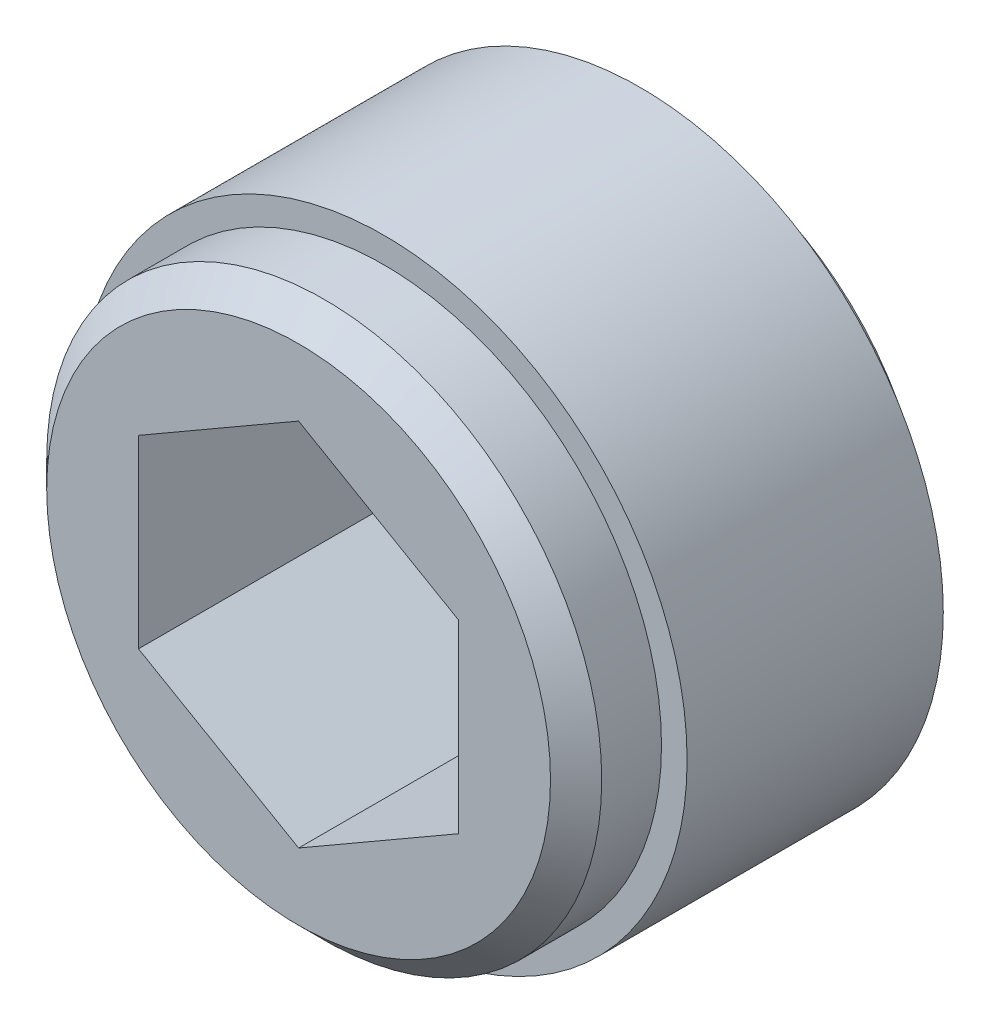
ISO-10303-21;
HEADER;
FILE_DESCRIPTION(('STEP AP214'),'2;1');
FILE_NAME('part.step','',(''),(''),'','','');
FILE_SCHEMA(('AUTOMOTIVE_DESIGN { 1 0 10303 214 1 1 1 1 }'));
ENDSEC;
DATA;
#1=APPLICATION_CONTEXT('core data for automotive mechanical design processes');
#2=APPLICATION_PROTOCOL_DEFINITION('international standard','automotive_design',2000,#1);
#3=PRODUCT_CONTEXT('',#1,'mechanical');
#4=PRODUCT('Part','Part','',(#3));
#5=PRODUCT_RELATED_PRODUCT_CATEGORY('part','',(#4));
#6=PRODUCT_DEFINITION_FORMATION('','',#4);
#7=PRODUCT_DEFINITION_CONTEXT('part definition',#1,'design');
#8=PRODUCT_DEFINITION('design','',#6,#7);
#9=PRODUCT_DEFINITION_SHAPE('','',#8);
#10=(LENGTH_UNIT() NAMED_UNIT(*) SI_UNIT(.MILLI.,.METRE.));
#11=(NAMED_UNIT(*) PLANE_ANGLE_UNIT() SI_UNIT($,.RADIAN.));
#12=(NAMED_UNIT(*) SI_UNIT($,.STERADIAN.) SOLID_ANGLE_UNIT());
#13=UNCERTAINTY_MEASURE_WITH_UNIT(LENGTH_MEASURE(1.E-05),#10,'distance_accuracy_value','');
#14=(GEOMETRIC_REPRESENTATION_CONTEXT(3) GLOBAL_UNCERTAINTY_ASSIGNED_CONTEXT((#13)) GLOBAL_UNIT_ASSIGNED_CONTEXT((#10,
#11,#12)) REPRESENTATION_CONTEXT('',''));
#15=CARTESIAN_POINT('',(0.,0.,0.));
#16=DIRECTION('',(0.,0.,1.));
#17=DIRECTION('',(1.,0.,0.));
#18=AXIS2_PLACEMENT_3D('',#15,#16,#17);
#19=CARTESIAN_POINT('',(0.,0.,5.08));
#20=DIRECTION('',(0.,0.,-1.));
#21=DIRECTION('',(-1.,0.,0.));
#22=AXIS2_PLACEMENT_3D('',#19,#20,#21);
#23=CYLINDRICAL_SURFACE('',#22,4.5085);
#24=CARTESIAN_POINT('',(0.,0.,0.));
#25=DIRECTION('',(0.,0.,1.));
#26=DIRECTION('',(1.,0.,0.));
#27=AXIS2_PLACEMENT_3D('',#24,#25,#26);
#28=CIRCLE('',#27,4.5085);
#29=CARTESIAN_POINT('',(4.5085,0.,0.));
#30=VERTEX_POINT('',#29);
#31=EDGE_CURVE('E164',#30,#30,#28,.T.);
#32=ORIENTED_EDGE('',*,*,#31,.T.);
#33=EDGE_LOOP('',(#32));
#34=FACE_BOUND('',#33,.T.);
#35=CARTESIAN_POINT('',(0.,0.,3.81));
#36=DIRECTION('',(0.,0.,1.));
#37=DIRECTION('',(1.,0.,0.));
#38=AXIS2_PLACEMENT_3D('',#35,#36,#37);
#39=CIRCLE('',#38,4.5085);
#40=CARTESIAN_POINT('',(4.5085,0.,3.81));
#41=VERTEX_POINT('',#40);
#42=EDGE_CURVE('E157',#41,#41,#39,.T.);
#43=ORIENTED_EDGE('',*,*,#42,.F.);
#44=EDGE_LOOP('',(#43));
#45=FACE_BOUND('',#44,.T.);
#46=ADVANCED_FACE('F48',(#34,#45),#23,.T.);
#47=CARTESIAN_POINT('',(0.,0.,0.));
#48=DIRECTION('',(0.,0.,1.));
#49=DIRECTION('',(1.,0.,0.));
#50=AXIS2_PLACEMENT_3D('',#47,#48,#49);
#51=PLANE('',#50);
#52=CARTESIAN_POINT('',(0.,0.,0.));
#53=DIRECTION('',(0.,0.,-1.));
#54=DIRECTION('',(-1.,0.,0.));
#55=AXIS2_PLACEMENT_3D('',#52,#53,#54);
#56=CIRCLE('',#55,3.81);
#57=CARTESIAN_POINT('',(-3.81,0.,0.));
#58=VERTEX_POINT('',#57);
#59=EDGE_CURVE('E161',#58,#58,#56,.T.);
#60=ORIENTED_EDGE('',*,*,#59,.F.);
#61=EDGE_LOOP('',(#60));
#62=FACE_BOUND('',#61,.T.);
#63=ORIENTED_EDGE('',*,*,#31,.F.);
#64=EDGE_LOOP('',(#63));
#65=FACE_BOUND('',#64,.T.);
#66=ADVANCED_FACE('F188',(#62,#65),#51,.F.);
#67=CARTESIAN_POINT('',(0.,0.,0.));
#68=DIRECTION('',(0.,0.,1.));
#69=DIRECTION('',(-1.,0.,0.));
#70=AXIS2_PLACEMENT_3D('',#67,#68,#69);
#71=CONICAL_SURFACE('',#70,3.81,0.26179938779915);
#72=CARTESIAN_POINT('',(0.,0.,-0.635));
#73=DIRECTION('',(0.,0.,-1.));
#74=DIRECTION('',(-1.,0.,0.));
#75=AXIS2_PLACEMENT_3D('',#72,#73,#74);
#76=CIRCLE('',#75,3.63985226280624);
#77=CARTESIAN_POINT('',(-3.63985226280624,0.,-0.635));
#78=VERTEX_POINT('',#77);
#79=EDGE_CURVE('E160',#78,#78,#76,.T.);
#80=ORIENTED_EDGE('',*,*,#79,.F.);
#81=EDGE_LOOP('',(#80));
#82=FACE_BOUND('',#81,.T.);
#83=ORIENTED_EDGE('',*,*,#59,.T.);
#84=EDGE_LOOP('',(#83));
#85=FACE_BOUND('',#84,.T.);
#86=ADVANCED_FACE('F193',(#82,#85),#71,.T.);
#87=CARTESIAN_POINT('',(0.,0.,-0.635));
#88=DIRECTION('',(0.,0.,-1.));
#89=DIRECTION('',(-1.,0.,0.));
#90=AXIS2_PLACEMENT_3D('',#87,#88,#89);
#91=PLANE('',#90);
#92=DIRECTION('',(0.866025403784439,-0.5,0.));
#93=VECTOR('',#92,1.);
#94=CARTESIAN_POINT('',(-2.38125,-1.3748153285078,-0.635));
#95=LINE('',#94,#93);
#96=CARTESIAN_POINT('',(-2.38125,-1.3748153285078,-0.635));
#97=VERTEX_POINT('',#96);
#98=CARTESIAN_POINT('',(0.,-2.74963065701559,-0.635));
#99=VERTEX_POINT('',#98);
#100=EDGE_CURVE('E104',#97,#99,#95,.T.);
#101=ORIENTED_EDGE('',*,*,#100,.T.);
#102=DIRECTION('',(0.866025403784438,0.5,0.));
#103=VECTOR('',#102,1.);
#104=CARTESIAN_POINT('',(0.,-2.74963065701559,-0.635));
#105=LINE('',#104,#103);
#106=CARTESIAN_POINT('',(2.38125,-1.3748153285078,-0.635));
#107=VERTEX_POINT('',#106);
#108=EDGE_CURVE('E113',#99,#107,#105,.T.);
#109=ORIENTED_EDGE('',*,*,#108,.T.);
#110=DIRECTION('',(0.,1.,0.));
#111=VECTOR('',#110,1.);
#112=CARTESIAN_POINT('',(2.38125,-1.3748153285078,-0.635));
#113=LINE('',#112,#111);
#114=CARTESIAN_POINT('',(2.38125,1.3748153285078,-0.635));
#115=VERTEX_POINT('',#114);
#116=EDGE_CURVE('E64',#107,#115,#113,.T.);
#117=ORIENTED_EDGE('',*,*,#116,.T.);
#118=DIRECTION('',(-0.866025403784439,0.5,0.));
#119=VECTOR('',#118,1.);
#120=CARTESIAN_POINT('',(2.38125,1.3748153285078,-0.635));
#121=LINE('',#120,#119);
#122=CARTESIAN_POINT('',(0.,2.74963065701559,-0.635));
#123=VERTEX_POINT('',#122);
#124=EDGE_CURVE('E128',#115,#123,#121,.T.);
#125=ORIENTED_EDGE('',*,*,#124,.T.);
#126=DIRECTION('',(-0.866025403784439,-0.5,0.));
#127=VECTOR('',#126,1.);
#128=CARTESIAN_POINT('',(0.,2.74963065701559,-0.635));
#129=LINE('',#128,#127);
#130=CARTESIAN_POINT('',(-2.38125,1.3748153285078,-0.635));
#131=VERTEX_POINT('',#130);
#132=EDGE_CURVE('E131',#123,#131,#129,.T.);
#133=ORIENTED_EDGE('',*,*,#132,.T.);
#134=DIRECTION('',(0.,-1.,0.));
#135=VECTOR('',#134,1.);
#136=CARTESIAN_POINT('',(-2.38125,1.3748153285078,-0.635));
#137=LINE('',#136,#135);
#138=EDGE_CURVE('E110',#131,#97,#137,.T.);
#139=ORIENTED_EDGE('',*,*,#138,.T.);
#140=EDGE_LOOP('',(#101,#109,#117,#125,#133,#139));
#141=FACE_BOUND('',#140,.T.);
#142=ORIENTED_EDGE('',*,*,#79,.T.);
#143=EDGE_LOOP('',(#142));
#144=FACE_BOUND('',#143,.T.);
#145=ADVANCED_FACE('F117',(#141,#144),#91,.T.);
#146=CARTESIAN_POINT('',(0.,0.,3.81));
#147=DIRECTION('',(0.,0.,1.));
#148=DIRECTION('',(1.,0.,0.));
#149=AXIS2_PLACEMENT_3D('',#146,#147,#148);
#150=CYLINDRICAL_SURFACE('',#149,4.1275);
#151=CARTESIAN_POINT('',(0.,0.,4.699));
#152=DIRECTION('',(0.,0.,1.));
#153=DIRECTION('',(1.,0.,0.));
#154=AXIS2_PLACEMENT_3D('',#151,#152,#153);
#155=CIRCLE('',#154,4.1275);
#156=CARTESIAN_POINT('',(-4.1275,0.,4.699));
#157=VERTEX_POINT('',#156);
#158=EDGE_CURVE('E11',#157,#157,#155,.F.);
#159=ORIENTED_EDGE('',*,*,#158,.T.);
#160=EDGE_LOOP('',(#159));
#161=FACE_BOUND('',#160,.T.);
#162=CARTESIAN_POINT('',(0.,0.,3.81));
#163=DIRECTION('',(0.,0.,1.));
#164=DIRECTION('',(1.,0.,0.));
#165=AXIS2_PLACEMENT_3D('',#162,#163,#164);
#166=CIRCLE('',#165,4.1275);
#167=CARTESIAN_POINT('',(4.1275,0.,3.81));
#168=VERTEX_POINT('',#167);
#169=EDGE_CURVE('E147',#168,#168,#166,.T.);
#170=ORIENTED_EDGE('',*,*,#169,.T.);
#171=EDGE_LOOP('',(#170));
#172=FACE_BOUND('',#171,.T.);
#173=ADVANCED_FACE('F202',(#161,#172),#150,.T.);
#174=CARTESIAN_POINT('',(0.,0.,3.81));
#175=DIRECTION('',(0.,0.,1.));
#176=DIRECTION('',(1.,0.,0.));
#177=AXIS2_PLACEMENT_3D('',#174,#175,#176);
#178=PLANE('',#177);
#179=ORIENTED_EDGE('',*,*,#169,.F.);
#180=EDGE_LOOP('',(#179));
#181=FACE_BOUND('',#180,.T.);
#182=ORIENTED_EDGE('',*,*,#42,.T.);
#183=EDGE_LOOP('',(#182));
#184=FACE_BOUND('',#183,.T.);
#185=ADVANCED_FACE('F183',(#181,#184),#178,.T.);
#186=CARTESIAN_POINT('',(0.,0.,5.08));
#187=DIRECTION('',(0.,0.,1.));
#188=DIRECTION('',(1.,0.,0.));
#189=AXIS2_PLACEMENT_3D('',#186,#187,#188);
#190=PLANE('',#189);
#191=DIRECTION('',(0.866025403784439,-0.5,0.));
#192=VECTOR('',#191,1.);
#193=CARTESIAN_POINT('',(-2.38125,-1.3748153285078,5.08));
#194=LINE('',#193,#192);
#195=CARTESIAN_POINT('',(-2.38125,-1.3748153285078,5.08));
#196=VERTEX_POINT('',#195);
#197=CARTESIAN_POINT('',(0.,-2.74963065701559,5.08));
#198=VERTEX_POINT('',#197);
#199=EDGE_CURVE('E72',#196,#198,#194,.T.);
#200=ORIENTED_EDGE('',*,*,#199,.F.);
#201=DIRECTION('',(0.,-1.,0.));
#202=VECTOR('',#201,1.);
#203=CARTESIAN_POINT('',(-2.38125,1.3748153285078,5.08));
#204=LINE('',#203,#202);
#205=CARTESIAN_POINT('',(-2.38125,1.3748153285078,5.08));
#206=VERTEX_POINT('',#205);
#207=EDGE_CURVE('E121',#206,#196,#204,.T.);
#208=ORIENTED_EDGE('',*,*,#207,.F.);
#209=DIRECTION('',(-0.866025403784439,-0.5,0.));
#210=VECTOR('',#209,1.);
#211=CARTESIAN_POINT('',(0.,2.74963065701559,5.08));
#212=LINE('',#211,#210);
#213=CARTESIAN_POINT('',(0.,2.74963065701559,5.08));
#214=VERTEX_POINT('',#213);
#215=EDGE_CURVE('E124',#214,#206,#212,.T.);
#216=ORIENTED_EDGE('',*,*,#215,.F.);
#217=DIRECTION('',(-0.866025403784439,0.5,0.));
#218=VECTOR('',#217,1.);
#219=CARTESIAN_POINT('',(2.38125,1.3748153285078,5.08));
#220=LINE('',#219,#218);
#221=CARTESIAN_POINT('',(2.38125,1.3748153285078,5.08));
#222=VERTEX_POINT('',#221);
#223=EDGE_CURVE('E140',#222,#214,#220,.T.);
#224=ORIENTED_EDGE('',*,*,#223,.F.);
#225=DIRECTION('',(0.,1.,0.));
#226=VECTOR('',#225,1.);
#227=CARTESIAN_POINT('',(2.38125,-1.3748153285078,5.08));
#228=LINE('',#227,#226);
#229=CARTESIAN_POINT('',(2.38125,-1.3748153285078,5.08));
#230=VERTEX_POINT('',#229);
#231=EDGE_CURVE('E137',#230,#222,#228,.T.);
#232=ORIENTED_EDGE('',*,*,#231,.F.);
#233=DIRECTION('',(0.866025403784438,0.5,0.));
#234=VECTOR('',#233,1.);
#235=CARTESIAN_POINT('',(0.,-2.74963065701559,5.08));
#236=LINE('',#235,#234);
#237=EDGE_CURVE('E135',#198,#230,#236,.T.);
#238=ORIENTED_EDGE('',*,*,#237,.F.);
#239=EDGE_LOOP('',(#200,#208,#216,#224,#232,#238));
#240=FACE_BOUND('',#239,.T.);
#241=CARTESIAN_POINT('',(0.,0.,5.08));
#242=DIRECTION('',(0.,0.,1.));
#243=DIRECTION('',(1.,0.,0.));
#244=AXIS2_PLACEMENT_3D('',#241,#242,#243);
#245=CIRCLE('',#244,3.7465);
#246=CARTESIAN_POINT('',(-3.7465,0.,5.08));
#247=VERTEX_POINT('',#246);
#248=EDGE_CURVE('E57',#247,#247,#245,.T.);
#249=ORIENTED_EDGE('',*,*,#248,.T.);
#250=EDGE_LOOP('',(#249));
#251=FACE_BOUND('',#250,.T.);
#252=ADVANCED_FACE('F171',(#240,#251),#190,.T.);
#253=CARTESIAN_POINT('',(0.,0.,5.08));
#254=DIRECTION('',(0.,0.,-1.));
#255=DIRECTION('',(-1.,0.,0.));
#256=AXIS2_PLACEMENT_3D('',#253,#254,#255);
#257=CONICAL_SURFACE('',#256,3.7465,0.785398163397446);
#258=CARTESIAN_POINT('',(-4.1275,0.,4.699));
#259=CARTESIAN_POINT('',(-4.12353125,0.,4.70296875));
#260=CARTESIAN_POINT('',(-4.1195625,0.,4.7069375));
#261=CARTESIAN_POINT('',(-4.111625,0.,4.714875));
#262=CARTESIAN_POINT('',(-4.10765625,0.,4.71884375));
#263=CARTESIAN_POINT('',(-4.09971875,0.,4.72678125));
#264=CARTESIAN_POINT('',(-4.09575,0.,4.73075));
#265=CARTESIAN_POINT('',(-4.0878125,0.,4.7386875));
#266=CARTESIAN_POINT('',(-4.08384375,0.,4.74265625));
#267=CARTESIAN_POINT('',(-4.07590625,0.,4.75059375));
#268=CARTESIAN_POINT('',(-4.0719375,0.,4.7545625));
#269=CARTESIAN_POINT('',(-4.064,0.,4.7625));
#270=CARTESIAN_POINT('',(-4.06003125,0.,4.76646875));
#271=CARTESIAN_POINT('',(-4.05209375,0.,4.77440625));
#272=CARTESIAN_POINT('',(-4.048125,0.,4.778375));
#273=CARTESIAN_POINT('',(-4.0401875,0.,4.7863125));
#274=CARTESIAN_POINT('',(-4.03621875,0.,4.79028125));
#275=CARTESIAN_POINT('',(-4.02828125,0.,4.79821875));
#276=CARTESIAN_POINT('',(-4.0243125,0.,4.8021875));
#277=CARTESIAN_POINT('',(-4.016375,0.,4.810125));
#278=CARTESIAN_POINT('',(-4.01240625,0.,4.81409375));
#279=CARTESIAN_POINT('',(-4.00446875,0.,4.82203125));
#280=CARTESIAN_POINT('',(-4.0005,0.,4.826));
#281=CARTESIAN_POINT('',(-3.9925625,0.,4.8339375));
#282=CARTESIAN_POINT('',(-3.98859375,0.,4.83790625));
#283=CARTESIAN_POINT('',(-3.98065625,0.,4.84584375));
#284=CARTESIAN_POINT('',(-3.9766875,0.,4.8498125));
#285=CARTESIAN_POINT('',(-3.96875,0.,4.85775));
#286=CARTESIAN_POINT('',(-3.96478125,0.,4.86171875));
#287=CARTESIAN_POINT('',(-3.95684375,0.,4.86965625));
#288=CARTESIAN_POINT('',(-3.952875,0.,4.873625));
#289=CARTESIAN_POINT('',(-3.9449375,0.,4.8815625));
#290=CARTESIAN_POINT('',(-3.94096875,0.,4.88553125));
#291=CARTESIAN_POINT('',(-3.93303125,0.,4.89346875));
#292=CARTESIAN_POINT('',(-3.9290625,0.,4.8974375));
#293=CARTESIAN_POINT('',(-3.921125,0.,4.905375));
#294=CARTESIAN_POINT('',(-3.91715625,0.,4.90934375));
#295=CARTESIAN_POINT('',(-3.90921875,0.,4.91728125));
#296=CARTESIAN_POINT('',(-3.90525,0.,4.92125));
#297=CARTESIAN_POINT('',(-3.8973125,0.,4.9291875));
#298=CARTESIAN_POINT('',(-3.89334375,0.,4.93315625));
#299=CARTESIAN_POINT('',(-3.88540625,0.,4.94109375));
#300=CARTESIAN_POINT('',(-3.8814375,0.,4.9450625));
#301=CARTESIAN_POINT('',(-3.8735,0.,4.953));
#302=CARTESIAN_POINT('',(-3.86953125,0.,4.95696875));
#303=CARTESIAN_POINT('',(-3.86159375,0.,4.96490625));
#304=CARTESIAN_POINT('',(-3.857625,0.,4.968875));
#305=CARTESIAN_POINT('',(-3.8496875,0.,4.9768125));
#306=CARTESIAN_POINT('',(-3.84571875,0.,4.98078125));
#307=CARTESIAN_POINT('',(-3.83778125,0.,4.98871875));
#308=CARTESIAN_POINT('',(-3.8338125,0.,4.9926875));
#309=CARTESIAN_POINT('',(-3.825875,0.,5.000625));
#310=CARTESIAN_POINT('',(-3.82190625,0.,5.00459375));
#311=CARTESIAN_POINT('',(-3.81396875,0.,5.01253125));
#312=CARTESIAN_POINT('',(-3.81,0.,5.0165));
#313=CARTESIAN_POINT('',(-3.8020625,0.,5.0244375));
#314=CARTESIAN_POINT('',(-3.79809375,0.,5.02840625));
#315=CARTESIAN_POINT('',(-3.79015625,0.,5.03634375));
#316=CARTESIAN_POINT('',(-3.7861875,0.,5.0403125));
#317=CARTESIAN_POINT('',(-3.77825,0.,5.04825));
#318=CARTESIAN_POINT('',(-3.77428125,0.,5.05221875));
#319=CARTESIAN_POINT('',(-3.76634375,0.,5.06015625));
#320=CARTESIAN_POINT('',(-3.762375,0.,5.064125));
#321=CARTESIAN_POINT('',(-3.7544375,0.,5.0720625));
#322=CARTESIAN_POINT('',(-3.75046875,0.,5.07603125));
#323=CARTESIAN_POINT('',(-3.7465,0.,5.08));
#324=B_SPLINE_CURVE_WITH_KNOTS('',3,(#258,#259,#260,#261,#262,#263,#264,#265,#266,#267,#268,
#269,#270,#271,#272,#273,#274,#275,#276,#277,#278,#279,#280,#281,#282,#283,#284,#285,#286,#287,
#288,#289,#290,#291,#292,#293,#294,#295,#296,#297,#298,#299,#300,#301,#302,#303,#304,#305,#306,
#307,#308,#309,#310,#311,#312,#313,#314,#315,#316,#317,#318,#319,#320,#321,#322,#323),
.UNSPECIFIED.,.F.,.F.,(4,2,2,2,2,2,2,2,2,2,2,2,2,2,2,2,2,2,2,2,2,2,2,2,2,2,2,2,2,2,2,2,4),(0.,
0.0168379802270056,0.0336759604540099,0.0505139406810142,0.0673519209080192,0.0841899011350235,
0.101027881362028,0.117865861589033,0.134703841816038,0.151541822043042,0.168379802270047,
0.185217782497052,0.202055762724056,0.218893742951061,0.235731723178065,0.25256970340507,
0.269407683632075,0.286245663859079,0.303083644086084,0.319921624313089,0.336759604540093,
0.353597584767098,0.370435564994103,0.387273545221107,0.404111525448112,0.420949505675117,
0.437787485902121,0.454625466129126,0.47146344635613,0.488301426583135,0.50513940681014,
0.521977387037144,0.538815367264149),.UNSPECIFIED.);
#325=EDGE_CURVE('BSEAM51',#157,#247,#324,.T.);
#326=ORIENTED_EDGE('',*,*,#158,.F.);
#327=ORIENTED_EDGE('',*,*,#248,.F.);
#328=ORIENTED_EDGE('',*,*,#325,.T.);
#329=ORIENTED_EDGE('',*,*,#325,.F.);
#330=EDGE_LOOP('',(#326,#328,#327,#329));
#331=FACE_BOUND('',#330,.T.);
#332=ADVANCED_FACE('F51',(#331),#257,.T.);
#333=CARTESIAN_POINT('',(-2.38125,-1.3748153285078,-0.635));
#334=DIRECTION('',(-0.5,-0.866025403784439,0.));
#335=DIRECTION('',(0.866025403784439,-0.5,0.));
#336=AXIS2_PLACEMENT_3D('',#333,#334,#335);
#337=PLANE('',#336);
#338=ORIENTED_EDGE('',*,*,#199,.T.);
#339=DIRECTION('',(0.,0.,1.));
#340=VECTOR('',#339,1.);
#341=CARTESIAN_POINT('',(0.,-2.74963065701559,-0.635));
#342=LINE('',#341,#340);
#343=EDGE_CURVE('E100',#99,#198,#342,.T.);
#344=ORIENTED_EDGE('',*,*,#343,.F.);
#345=ORIENTED_EDGE('',*,*,#100,.F.);
#346=DIRECTION('',(0.,0.,1.));
#347=VECTOR('',#346,1.);
#348=CARTESIAN_POINT('',(-2.38125,-1.3748153285078,-0.635));
#349=LINE('',#348,#347);
#350=EDGE_CURVE('E145',#97,#196,#349,.T.);
#351=ORIENTED_EDGE('',*,*,#350,.T.);
#352=EDGE_LOOP('',(#338,#344,#345,#351));
#353=FACE_BOUND('',#352,.T.);
#354=ADVANCED_FACE('F102',(#353),#337,.F.);
#355=CARTESIAN_POINT('',(-2.38125,1.3748153285078,-0.635));
#356=DIRECTION('',(-1.,0.,0.));
#357=DIRECTION('',(0.,0.,1.));
#358=AXIS2_PLACEMENT_3D('',#355,#356,#357);
#359=PLANE('',#358);
#360=ORIENTED_EDGE('',*,*,#207,.T.);
#361=ORIENTED_EDGE('',*,*,#350,.F.);
#362=ORIENTED_EDGE('',*,*,#138,.F.);
#363=DIRECTION('',(0.,0.,1.));
#364=VECTOR('',#363,1.);
#365=CARTESIAN_POINT('',(-2.38125,1.3748153285078,-0.635));
#366=LINE('',#365,#364);
#367=EDGE_CURVE('E148',#131,#206,#366,.T.);
#368=ORIENTED_EDGE('',*,*,#367,.T.);
#369=EDGE_LOOP('',(#360,#361,#362,#368));
#370=FACE_BOUND('',#369,.T.);
#371=ADVANCED_FACE('F180',(#370),#359,.F.);
#372=CARTESIAN_POINT('',(0.,2.74963065701559,-0.635));
#373=DIRECTION('',(-0.5,0.866025403784439,0.));
#374=DIRECTION('',(-0.866025403784439,-0.5,0.));
#375=AXIS2_PLACEMENT_3D('',#372,#373,#374);
#376=PLANE('',#375);
#377=ORIENTED_EDGE('',*,*,#215,.T.);
#378=ORIENTED_EDGE('',*,*,#367,.F.);
#379=ORIENTED_EDGE('',*,*,#132,.F.);
#380=DIRECTION('',(0.,0.,1.));
#381=VECTOR('',#380,1.);
#382=CARTESIAN_POINT('',(0.,2.74963065701559,-0.635));
#383=LINE('',#382,#381);
#384=EDGE_CURVE('E150',#123,#214,#383,.T.);
#385=ORIENTED_EDGE('',*,*,#384,.T.);
#386=EDGE_LOOP('',(#377,#378,#379,#385));
#387=FACE_BOUND('',#386,.T.);
#388=ADVANCED_FACE('F216',(#387),#376,.F.);
#389=CARTESIAN_POINT('',(2.38125,1.3748153285078,-0.635));
#390=DIRECTION('',(0.5,0.866025403784439,0.));
#391=DIRECTION('',(-0.866025403784439,0.5,0.));
#392=AXIS2_PLACEMENT_3D('',#389,#390,#391);
#393=PLANE('',#392);
#394=ORIENTED_EDGE('',*,*,#223,.T.);
#395=ORIENTED_EDGE('',*,*,#384,.F.);
#396=ORIENTED_EDGE('',*,*,#124,.F.);
#397=DIRECTION('',(0.,0.,1.));
#398=VECTOR('',#397,1.);
#399=CARTESIAN_POINT('',(2.38125,1.3748153285078,-0.635));
#400=LINE('',#399,#398);
#401=EDGE_CURVE('E152',#115,#222,#400,.T.);
#402=ORIENTED_EDGE('',*,*,#401,.T.);
#403=EDGE_LOOP('',(#394,#395,#396,#402));
#404=FACE_BOUND('',#403,.T.);
#405=ADVANCED_FACE('F213',(#404),#393,.F.);
#406=CARTESIAN_POINT('',(2.38125,-1.3748153285078,-0.635));
#407=DIRECTION('',(1.,0.,0.));
#408=DIRECTION('',(0.,0.,-1.));
#409=AXIS2_PLACEMENT_3D('',#406,#407,#408);
#410=PLANE('',#409);
#411=ORIENTED_EDGE('',*,*,#231,.T.);
#412=ORIENTED_EDGE('',*,*,#401,.F.);
#413=ORIENTED_EDGE('',*,*,#116,.F.);
#414=DIRECTION('',(0.,0.,1.));
#415=VECTOR('',#414,1.);
#416=CARTESIAN_POINT('',(2.38125,-1.3748153285078,-0.635));
#417=LINE('',#416,#415);
#418=EDGE_CURVE('E109',#107,#230,#417,.T.);
#419=ORIENTED_EDGE('',*,*,#418,.T.);
#420=EDGE_LOOP('',(#411,#412,#413,#419));
#421=FACE_BOUND('',#420,.T.);
#422=ADVANCED_FACE('F210',(#421),#410,.F.);
#423=CARTESIAN_POINT('',(0.,-2.74963065701559,-0.635));
#424=DIRECTION('',(0.500000000000001,-0.866025403784438,0.));
#425=DIRECTION('',(0.866025403784438,0.500000000000001,0.));
#426=AXIS2_PLACEMENT_3D('',#423,#424,#425);
#427=PLANE('',#426);
#428=ORIENTED_EDGE('',*,*,#237,.T.);
#429=ORIENTED_EDGE('',*,*,#418,.F.);
#430=ORIENTED_EDGE('',*,*,#108,.F.);
#431=ORIENTED_EDGE('',*,*,#343,.T.);
#432=EDGE_LOOP('',(#428,#429,#430,#431));
#433=FACE_BOUND('',#432,.T.);
#434=ADVANCED_FACE('F114',(#433),#427,.F.);
#435=CLOSED_SHELL('',(#46,#66,#86,#145,#173,#185,#252,#332,#354,#371,#388,#405,#422,#434));
#436=MANIFOLD_SOLID_BREP('B2',#435);
#437=ADVANCED_BREP_SHAPE_REPRESENTATION('',(#18,#436),#14);
#438=SHAPE_DEFINITION_REPRESENTATION(#9,#437);
ENDSEC;
END-ISO-10303-21;
